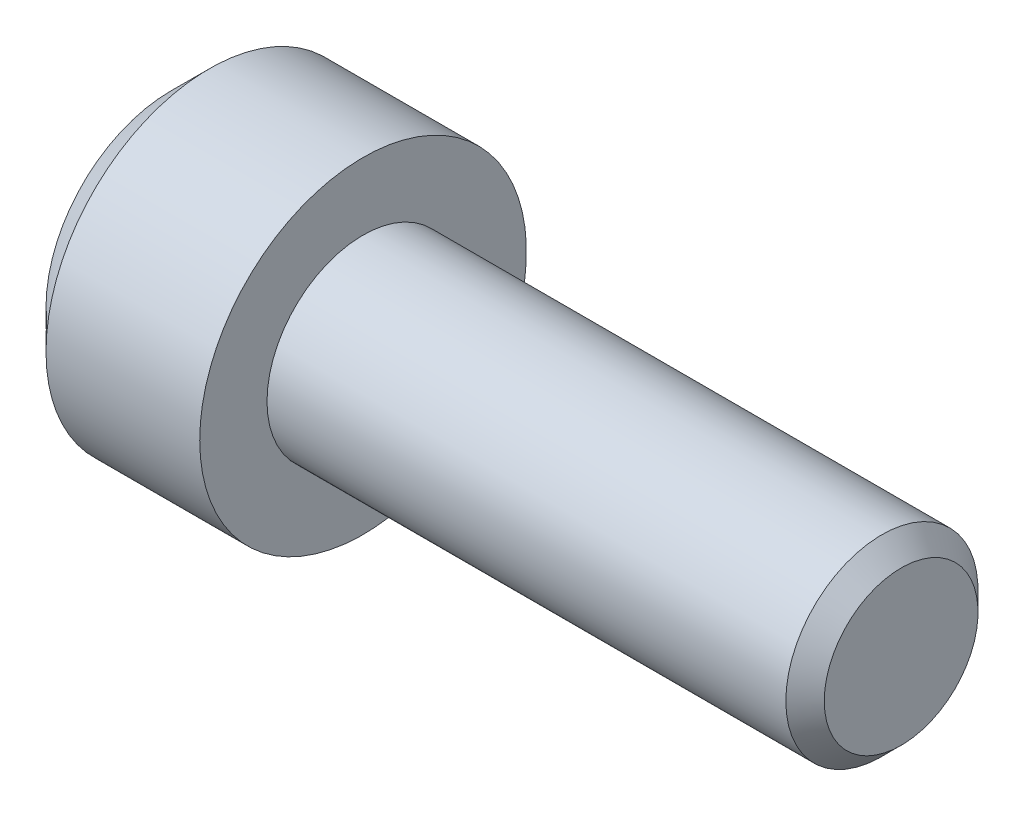
ISO-10303-21;
HEADER;
FILE_DESCRIPTION(('STEP AP214'),'2;1');
FILE_NAME('part.step','',(''),(''),'','','');
FILE_SCHEMA(('AUTOMOTIVE_DESIGN { 1 0 10303 214 1 1 1 1 }'));
ENDSEC;
DATA;
#1=APPLICATION_CONTEXT('core data for automotive mechanical design processes');
#2=APPLICATION_PROTOCOL_DEFINITION('international standard','automotive_design',2000,#1);
#3=PRODUCT_CONTEXT('',#1,'mechanical');
#4=PRODUCT('Part','Part','',(#3));
#5=PRODUCT_RELATED_PRODUCT_CATEGORY('part','',(#4));
#6=PRODUCT_DEFINITION_FORMATION('','',#4);
#7=PRODUCT_DEFINITION_CONTEXT('part definition',#1,'design');
#8=PRODUCT_DEFINITION('design','',#6,#7);
#9=PRODUCT_DEFINITION_SHAPE('','',#8);
#10=(LENGTH_UNIT() NAMED_UNIT(*) SI_UNIT(.MILLI.,.METRE.));
#11=(NAMED_UNIT(*) PLANE_ANGLE_UNIT() SI_UNIT($,.RADIAN.));
#12=(NAMED_UNIT(*) SI_UNIT($,.STERADIAN.) SOLID_ANGLE_UNIT());
#13=UNCERTAINTY_MEASURE_WITH_UNIT(LENGTH_MEASURE(1.E-05),#10,'distance_accuracy_value','');
#14=(GEOMETRIC_REPRESENTATION_CONTEXT(3) GLOBAL_UNCERTAINTY_ASSIGNED_CONTEXT((#13)) GLOBAL_UNIT_ASSIGNED_CONTEXT((#10,
#11,#12)) REPRESENTATION_CONTEXT('',''));
#15=CARTESIAN_POINT('',(0.,0.,0.));
#16=DIRECTION('',(0.,0.,1.));
#17=DIRECTION('',(1.,0.,0.));
#18=AXIS2_PLACEMENT_3D('',#15,#16,#17);
#19=CARTESIAN_POINT('',(0.,0.,0.));
#20=DIRECTION('',(-1.,0.,0.));
#21=DIRECTION('',(0.,0.,1.));
#22=AXIS2_PLACEMENT_3D('',#19,#20,#21);
#23=PLANE('',#22);
#24=CARTESIAN_POINT('',(0.,0.,0.));
#25=DIRECTION('',(-1.,0.,0.));
#26=DIRECTION('',(0.,0.,1.));
#27=AXIS2_PLACEMENT_3D('',#24,#25,#26);
#28=CIRCLE('',#27,2.);
#29=CARTESIAN_POINT('',(0.,0.,2.));
#30=VERTEX_POINT('',#29);
#31=EDGE_CURVE('E151',#30,#30,#28,.F.);
#32=ORIENTED_EDGE('',*,*,#31,.T.);
#33=EDGE_LOOP('',(#32));
#34=FACE_BOUND('',#33,.T.);
#35=ADVANCED_FACE('F45',(#34),#23,.F.);
#36=CARTESIAN_POINT('',(0.,0.,0.));
#37=DIRECTION('',(-1.,0.,0.));
#38=DIRECTION('',(0.,0.,1.));
#39=AXIS2_PLACEMENT_3D('',#36,#37,#38);
#40=CYLINDRICAL_SURFACE('',#39,2.5);
#41=CARTESIAN_POINT('',(-0.499999999999997,0.,0.));
#42=DIRECTION('',(-1.,0.,0.));
#43=DIRECTION('',(0.,0.,1.));
#44=AXIS2_PLACEMENT_3D('',#41,#42,#43);
#45=CIRCLE('',#44,2.5);
#46=CARTESIAN_POINT('',(-0.499999999999997,0.,2.5));
#47=VERTEX_POINT('',#46);
#48=EDGE_CURVE('E147',#47,#47,#45,.T.);
#49=ORIENTED_EDGE('',*,*,#48,.T.);
#50=EDGE_LOOP('',(#49));
#51=FACE_BOUND('',#50,.T.);
#52=CARTESIAN_POINT('',(-14.,0.,0.));
#53=DIRECTION('',(-1.,0.,0.));
#54=DIRECTION('',(0.,0.,1.));
#55=AXIS2_PLACEMENT_3D('',#52,#53,#54);
#56=CIRCLE('',#55,2.5);
#57=CARTESIAN_POINT('',(-14.,0.,2.5));
#58=VERTEX_POINT('',#57);
#59=EDGE_CURVE('E144',#58,#58,#56,.T.);
#60=ORIENTED_EDGE('',*,*,#59,.F.);
#61=EDGE_LOOP('',(#60));
#62=FACE_BOUND('',#61,.T.);
#63=ADVANCED_FACE('F175',(#51,#62),#40,.T.);
#64=CARTESIAN_POINT('',(-14.,2.5,0.));
#65=DIRECTION('',(-1.,0.,0.));
#66=DIRECTION('',(0.,0.,1.));
#67=AXIS2_PLACEMENT_3D('',#64,#65,#66);
#68=PLANE('',#67);
#69=CARTESIAN_POINT('',(-14.,0.,0.));
#70=DIRECTION('',(-1.,0.,0.));
#71=DIRECTION('',(0.,0.,1.));
#72=AXIS2_PLACEMENT_3D('',#69,#70,#71);
#73=CIRCLE('',#72,4.25);
#74=CARTESIAN_POINT('',(-14.,0.,4.25));
#75=VERTEX_POINT('',#74);
#76=EDGE_CURVE('E128',#75,#75,#73,.T.);
#77=ORIENTED_EDGE('',*,*,#76,.F.);
#78=EDGE_LOOP('',(#77));
#79=FACE_BOUND('',#78,.T.);
#80=ORIENTED_EDGE('',*,*,#59,.T.);
#81=EDGE_LOOP('',(#80));
#82=FACE_BOUND('',#81,.T.);
#83=ADVANCED_FACE('F180',(#79,#82),#68,.F.);
#84=CARTESIAN_POINT('',(0.,0.,0.));
#85=DIRECTION('',(-1.,0.,0.));
#86=DIRECTION('',(0.,0.,1.));
#87=AXIS2_PLACEMENT_3D('',#84,#85,#86);
#88=CYLINDRICAL_SURFACE('',#87,4.25);
#89=CARTESIAN_POINT('',(-18.,0.,0.));
#90=DIRECTION('',(1.,0.,0.));
#91=DIRECTION('',(0.,0.,-1.));
#92=AXIS2_PLACEMENT_3D('',#89,#90,#91);
#93=CIRCLE('',#92,4.25);
#94=CARTESIAN_POINT('',(-18.,0.,-4.25));
#95=VERTEX_POINT('',#94);
#96=EDGE_CURVE('E11',#95,#95,#93,.T.);
#97=ORIENTED_EDGE('',*,*,#96,.T.);
#98=EDGE_LOOP('',(#97));
#99=FACE_BOUND('',#98,.T.);
#100=ORIENTED_EDGE('',*,*,#76,.T.);
#101=EDGE_LOOP('',(#100));
#102=FACE_BOUND('',#101,.T.);
#103=ADVANCED_FACE('F192',(#99,#102),#88,.T.);
#104=CARTESIAN_POINT('',(-19.,4.25,0.));
#105=DIRECTION('',(1.,0.,0.));
#106=DIRECTION('',(0.,0.,-1.));
#107=AXIS2_PLACEMENT_3D('',#104,#105,#106);
#108=PLANE('',#107);
#109=CARTESIAN_POINT('',(-19.,0.,0.));
#110=DIRECTION('',(1.,0.,0.));
#111=DIRECTION('',(0.,0.,-1.));
#112=AXIS2_PLACEMENT_3D('',#109,#110,#111);
#113=CIRCLE('',#112,3.25);
#114=CARTESIAN_POINT('',(-19.,0.,-3.25));
#115=VERTEX_POINT('',#114);
#116=EDGE_CURVE('E54',#115,#115,#113,.F.);
#117=ORIENTED_EDGE('',*,*,#116,.T.);
#118=EDGE_LOOP('',(#117));
#119=FACE_BOUND('',#118,.T.);
#120=DIRECTION('',(0.,-0.5,-0.866025403784439));
#121=VECTOR('',#120,1.);
#122=CARTESIAN_POINT('',(-19.,2.3094010767585,0.));
#123=LINE('',#122,#121);
#124=CARTESIAN_POINT('',(-19.,2.3094010767585,0.));
#125=VERTEX_POINT('',#124);
#126=CARTESIAN_POINT('',(-19.,1.15470053837925,-2.));
#127=VERTEX_POINT('',#126);
#128=EDGE_CURVE('E378',#125,#127,#123,.T.);
#129=ORIENTED_EDGE('',*,*,#128,.F.);
#130=DIRECTION('',(0.,0.5,-0.866025403784439));
#131=VECTOR('',#130,1.);
#132=CARTESIAN_POINT('',(-19.,1.15470053837925,2.));
#133=LINE('',#132,#131);
#134=CARTESIAN_POINT('',(-19.,1.15470053837925,2.));
#135=VERTEX_POINT('',#134);
#136=EDGE_CURVE('E61',#135,#125,#133,.T.);
#137=ORIENTED_EDGE('',*,*,#136,.F.);
#138=DIRECTION('',(0.,1.,0.));
#139=VECTOR('',#138,1.);
#140=CARTESIAN_POINT('',(-19.,-1.15470053837925,2.));
#141=LINE('',#140,#139);
#142=CARTESIAN_POINT('',(-19.,-1.15470053837925,2.));
#143=VERTEX_POINT('',#142);
#144=EDGE_CURVE('E96',#143,#135,#141,.T.);
#145=ORIENTED_EDGE('',*,*,#144,.F.);
#146=DIRECTION('',(0.,0.5,0.866025403784439));
#147=VECTOR('',#146,1.);
#148=CARTESIAN_POINT('',(-19.,-2.3094010767585,0.));
#149=LINE('',#148,#147);
#150=CARTESIAN_POINT('',(-19.,-2.3094010767585,0.));
#151=VERTEX_POINT('',#150);
#152=EDGE_CURVE('E105',#151,#143,#149,.T.);
#153=ORIENTED_EDGE('',*,*,#152,.F.);
#154=DIRECTION('',(0.,-0.5,0.866025403784439));
#155=VECTOR('',#154,1.);
#156=CARTESIAN_POINT('',(-19.,-1.15470053837925,-2.));
#157=LINE('',#156,#155);
#158=CARTESIAN_POINT('',(-19.,-1.15470053837925,-2.));
#159=VERTEX_POINT('',#158);
#160=EDGE_CURVE('E112',#159,#151,#157,.T.);
#161=ORIENTED_EDGE('',*,*,#160,.F.);
#162=DIRECTION('',(0.,-1.,0.));
#163=VECTOR('',#162,1.);
#164=CARTESIAN_POINT('',(-19.,1.15470053837925,-2.));
#165=LINE('',#164,#163);
#166=EDGE_CURVE('E382',#127,#159,#165,.T.);
#167=ORIENTED_EDGE('',*,*,#166,.F.);
#168=EDGE_LOOP('',(#129,#137,#145,#153,#161,#167));
#169=FACE_BOUND('',#168,.T.);
#170=ADVANCED_FACE('F115',(#119,#169),#108,.F.);
#171=CARTESIAN_POINT('',(-0.499999999999997,0.,0.));
#172=DIRECTION('',(-1.,0.,0.));
#173=DIRECTION('',(0.,0.,1.));
#174=AXIS2_PLACEMENT_3D('',#171,#172,#173);
#175=CONICAL_SURFACE('',#174,2.5,0.78539816339745);
#176=ORIENTED_EDGE('',*,*,#31,.F.);
#177=EDGE_LOOP('',(#176));
#178=FACE_BOUND('',#177,.T.);
#179=ORIENTED_EDGE('',*,*,#48,.F.);
#180=EDGE_LOOP('',(#179));
#181=FACE_BOUND('',#180,.T.);
#182=ADVANCED_FACE('F184',(#178,#181),#175,.T.);
#183=CARTESIAN_POINT('',(-16.5,1.15470053837925,2.));
#184=DIRECTION('',(0.,0.866025403784439,0.5));
#185=DIRECTION('',(0.,-0.5,0.866025403784439));
#186=AXIS2_PLACEMENT_3D('',#183,#184,#185);
#187=PLANE('',#186);
#188=ORIENTED_EDGE('',*,*,#136,.T.);
#189=DIRECTION('',(-1.,0.,0.));
#190=VECTOR('',#189,1.);
#191=CARTESIAN_POINT('',(-16.5,2.3094010767585,0.));
#192=LINE('',#191,#190);
#193=CARTESIAN_POINT('',(-16.5,2.3094010767585,0.));
#194=VERTEX_POINT('',#193);
#195=EDGE_CURVE('E138',#194,#125,#192,.T.);
#196=ORIENTED_EDGE('',*,*,#195,.F.);
#197=DIRECTION('',(0.,0.5,-0.866025403784439));
#198=VECTOR('',#197,1.);
#199=CARTESIAN_POINT('',(-16.5,1.15470053837925,2.));
#200=LINE('',#199,#198);
#201=CARTESIAN_POINT('',(-16.5,1.15470053837925,2.));
#202=VERTEX_POINT('',#201);
#203=EDGE_CURVE('E117',#202,#194,#200,.T.);
#204=ORIENTED_EDGE('',*,*,#203,.F.);
#205=DIRECTION('',(-1.,0.,0.));
#206=VECTOR('',#205,1.);
#207=CARTESIAN_POINT('',(-16.5,1.15470053837925,2.));
#208=LINE('',#207,#206);
#209=EDGE_CURVE('E101',#202,#135,#208,.T.);
#210=ORIENTED_EDGE('',*,*,#209,.T.);
#211=EDGE_LOOP('',(#188,#196,#204,#210));
#212=FACE_BOUND('',#211,.T.);
#213=ADVANCED_FACE('F186',(#212),#187,.F.);
#214=CARTESIAN_POINT('',(-16.5,-1.15470053837925,2.));
#215=DIRECTION('',(0.,0.,1.));
#216=DIRECTION('',(0.,-1.,0.));
#217=AXIS2_PLACEMENT_3D('',#214,#215,#216);
#218=PLANE('',#217);
#219=ORIENTED_EDGE('',*,*,#144,.T.);
#220=ORIENTED_EDGE('',*,*,#209,.F.);
#221=DIRECTION('',(0.,1.,0.));
#222=VECTOR('',#221,1.);
#223=CARTESIAN_POINT('',(-16.5,-1.15470053837925,2.));
#224=LINE('',#223,#222);
#225=CARTESIAN_POINT('',(-16.5,-1.15470053837925,2.));
#226=VERTEX_POINT('',#225);
#227=EDGE_CURVE('E98',#226,#202,#224,.T.);
#228=ORIENTED_EDGE('',*,*,#227,.F.);
#229=DIRECTION('',(-1.,0.,0.));
#230=VECTOR('',#229,1.);
#231=CARTESIAN_POINT('',(-16.5,-1.15470053837925,2.));
#232=LINE('',#231,#230);
#233=EDGE_CURVE('E91',#226,#143,#232,.T.);
#234=ORIENTED_EDGE('',*,*,#233,.T.);
#235=EDGE_LOOP('',(#219,#220,#228,#234));
#236=FACE_BOUND('',#235,.T.);
#237=ADVANCED_FACE('F93',(#236),#218,.F.);
#238=CARTESIAN_POINT('',(-16.5,-2.3094010767585,0.));
#239=DIRECTION('',(0.,-0.866025403784439,0.5));
#240=DIRECTION('',(0.,-0.5,-0.866025403784439));
#241=AXIS2_PLACEMENT_3D('',#238,#239,#240);
#242=PLANE('',#241);
#243=ORIENTED_EDGE('',*,*,#152,.T.);
#244=ORIENTED_EDGE('',*,*,#233,.F.);
#245=DIRECTION('',(0.,0.5,0.866025403784439));
#246=VECTOR('',#245,1.);
#247=CARTESIAN_POINT('',(-16.5,-2.3094010767585,0.));
#248=LINE('',#247,#246);
#249=CARTESIAN_POINT('',(-16.5,-2.3094010767585,0.));
#250=VERTEX_POINT('',#249);
#251=EDGE_CURVE('E70',#250,#226,#248,.T.);
#252=ORIENTED_EDGE('',*,*,#251,.F.);
#253=DIRECTION('',(-1.,0.,0.));
#254=VECTOR('',#253,1.);
#255=CARTESIAN_POINT('',(-16.5,-2.3094010767585,0.));
#256=LINE('',#255,#254);
#257=EDGE_CURVE('E102',#250,#151,#256,.T.);
#258=ORIENTED_EDGE('',*,*,#257,.T.);
#259=EDGE_LOOP('',(#243,#244,#252,#258));
#260=FACE_BOUND('',#259,.T.);
#261=ADVANCED_FACE('F106',(#260),#242,.F.);
#262=CARTESIAN_POINT('',(-16.5,-1.15470053837925,-2.));
#263=DIRECTION('',(0.,-0.866025403784439,-0.5));
#264=DIRECTION('',(0.,0.5,-0.866025403784439));
#265=AXIS2_PLACEMENT_3D('',#262,#263,#264);
#266=PLANE('',#265);
#267=ORIENTED_EDGE('',*,*,#160,.T.);
#268=ORIENTED_EDGE('',*,*,#257,.F.);
#269=DIRECTION('',(0.,-0.5,0.866025403784439));
#270=VECTOR('',#269,1.);
#271=CARTESIAN_POINT('',(-16.5,-1.15470053837925,-2.));
#272=LINE('',#271,#270);
#273=CARTESIAN_POINT('',(-16.5,-1.15470053837925,-2.));
#274=VERTEX_POINT('',#273);
#275=EDGE_CURVE('E371',#274,#250,#272,.T.);
#276=ORIENTED_EDGE('',*,*,#275,.F.);
#277=DIRECTION('',(-1.,0.,0.));
#278=VECTOR('',#277,1.);
#279=CARTESIAN_POINT('',(-16.5,-1.15470053837925,-2.));
#280=LINE('',#279,#278);
#281=EDGE_CURVE('E132',#274,#159,#280,.T.);
#282=ORIENTED_EDGE('',*,*,#281,.T.);
#283=EDGE_LOOP('',(#267,#268,#276,#282));
#284=FACE_BOUND('',#283,.T.);
#285=ADVANCED_FACE('F210',(#284),#266,.F.);
#286=CARTESIAN_POINT('',(-16.5,1.15470053837925,-2.));
#287=DIRECTION('',(0.,0.,-1.));
#288=DIRECTION('',(-1.,0.,0.));
#289=AXIS2_PLACEMENT_3D('',#286,#287,#288);
#290=PLANE('',#289);
#291=ORIENTED_EDGE('',*,*,#166,.T.);
#292=ORIENTED_EDGE('',*,*,#281,.F.);
#293=DIRECTION('',(0.,-1.,0.));
#294=VECTOR('',#293,1.);
#295=CARTESIAN_POINT('',(-16.5,1.15470053837925,-2.));
#296=LINE('',#295,#294);
#297=CARTESIAN_POINT('',(-16.5,1.15470053837925,-2.));
#298=VERTEX_POINT('',#297);
#299=EDGE_CURVE('E369',#298,#274,#296,.T.);
#300=ORIENTED_EDGE('',*,*,#299,.F.);
#301=DIRECTION('',(-1.,0.,0.));
#302=VECTOR('',#301,1.);
#303=CARTESIAN_POINT('',(-16.5,1.15470053837925,-2.));
#304=LINE('',#303,#302);
#305=EDGE_CURVE('E135',#298,#127,#304,.T.);
#306=ORIENTED_EDGE('',*,*,#305,.T.);
#307=EDGE_LOOP('',(#291,#292,#300,#306));
#308=FACE_BOUND('',#307,.T.);
#309=ADVANCED_FACE('F170',(#308),#290,.F.);
#310=CARTESIAN_POINT('',(-16.5,2.3094010767585,0.));
#311=DIRECTION('',(0.,0.866025403784439,-0.5));
#312=DIRECTION('',(0.,0.5,0.866025403784439));
#313=AXIS2_PLACEMENT_3D('',#310,#311,#312);
#314=PLANE('',#313);
#315=ORIENTED_EDGE('',*,*,#128,.T.);
#316=ORIENTED_EDGE('',*,*,#305,.F.);
#317=DIRECTION('',(0.,-0.5,-0.866025403784439));
#318=VECTOR('',#317,1.);
#319=CARTESIAN_POINT('',(-16.5,2.3094010767585,0.));
#320=LINE('',#319,#318);
#321=EDGE_CURVE('E123',#194,#298,#320,.T.);
#322=ORIENTED_EDGE('',*,*,#321,.F.);
#323=ORIENTED_EDGE('',*,*,#195,.T.);
#324=EDGE_LOOP('',(#315,#316,#322,#323));
#325=FACE_BOUND('',#324,.T.);
#326=ADVANCED_FACE('F162',(#325),#314,.F.);
#327=CARTESIAN_POINT('',(-19.,0.,0.));
#328=DIRECTION('',(1.,0.,0.));
#329=DIRECTION('',(0.,0.,-1.));
#330=AXIS2_PLACEMENT_3D('',#327,#328,#329);
#331=CONICAL_SURFACE('',#330,3.25,0.785398163397447);
#332=ORIENTED_EDGE('',*,*,#96,.F.);
#333=EDGE_LOOP('',(#332));
#334=FACE_BOUND('',#333,.T.);
#335=ORIENTED_EDGE('',*,*,#116,.F.);
#336=EDGE_LOOP('',(#335));
#337=FACE_BOUND('',#336,.T.);
#338=ADVANCED_FACE('F47',(#334,#337),#331,.T.);
#339=CARTESIAN_POINT('',(-16.5,-1.15470053837925,-2.));
#340=DIRECTION('',(0.857167300702113,-0.446036056788338,-0.257519037455026));
#341=DIRECTION('',(0.461604487477352,0.887085845417889,0.));
#342=AXIS2_PLACEMENT_3D('',#339,#340,#341);
#343=PLANE('',#342);
#344=ORIENTED_EDGE('',*,*,#275,.T.);
#345=DIRECTION('',(-0.461604487477352,-0.887085845417889,0.));
#346=VECTOR('',#345,1.);
#347=CARTESIAN_POINT('',(-16.027169982274,-1.40074263128796,0.));
#348=LINE('',#347,#346);
#349=CARTESIAN_POINT('',(-15.2982787619449,0.,0.));
#350=VERTEX_POINT('',#349);
#351=EDGE_CURVE('E390',#350,#250,#348,.T.);
#352=ORIENTED_EDGE('',*,*,#351,.F.);
#353=DIRECTION('',(-0.461604487477352,-0.443542922708944,-0.768238877469488));
#354=VECTOR('',#353,1.);
#355=CARTESIAN_POINT('',(-16.027169982274,-0.700371315643979,-1.21307870285923));
#356=LINE('',#355,#354);
#357=EDGE_CURVE('E355',#350,#274,#356,.T.);
#358=ORIENTED_EDGE('',*,*,#357,.T.);
#359=EDGE_LOOP('',(#344,#352,#358));
#360=FACE_BOUND('',#359,.T.);
#361=ADVANCED_FACE('F161',(#360),#343,.F.);
#362=CARTESIAN_POINT('',(-16.5,1.15470053837925,-2.));
#363=DIRECTION('',(0.857167300702113,0.,-0.515038074910052));
#364=DIRECTION('',(-0.515038074910052,0.,-0.857167300702113));
#365=AXIS2_PLACEMENT_3D('',#362,#363,#364);
#366=PLANE('',#365);
#367=ORIENTED_EDGE('',*,*,#299,.T.);
#368=ORIENTED_EDGE('',*,*,#357,.F.);
#369=DIRECTION('',(-0.461604487477352,0.443542922708945,-0.768238877469487));
#370=VECTOR('',#369,1.);
#371=CARTESIAN_POINT('',(-16.027169982274,0.700371315643978,-1.21307870285923));
#372=LINE('',#371,#370);
#373=EDGE_CURVE('E357',#350,#298,#372,.T.);
#374=ORIENTED_EDGE('',*,*,#373,.T.);
#375=EDGE_LOOP('',(#367,#368,#374));
#376=FACE_BOUND('',#375,.T.);
#377=ADVANCED_FACE('F167',(#376),#366,.F.);
#378=CARTESIAN_POINT('',(-16.5,2.3094010767585,0.));
#379=DIRECTION('',(0.857167300702113,0.446036056788338,-0.257519037455026));
#380=DIRECTION('',(-0.461604487477352,0.887085845417889,0.));
#381=AXIS2_PLACEMENT_3D('',#378,#379,#380);
#382=PLANE('',#381);
#383=ORIENTED_EDGE('',*,*,#321,.T.);
#384=ORIENTED_EDGE('',*,*,#373,.F.);
#385=DIRECTION('',(-0.461604487477352,0.887085845417889,0.));
#386=VECTOR('',#385,1.);
#387=CARTESIAN_POINT('',(-16.027169982274,1.40074263128796,0.));
#388=LINE('',#387,#386);
#389=EDGE_CURVE('E342',#350,#194,#388,.T.);
#390=ORIENTED_EDGE('',*,*,#389,.T.);
#391=EDGE_LOOP('',(#383,#384,#390));
#392=FACE_BOUND('',#391,.T.);
#393=ADVANCED_FACE('F221',(#392),#382,.F.);
#394=CARTESIAN_POINT('',(-16.5,1.15470053837925,2.));
#395=DIRECTION('',(0.857167300702113,0.446036056788338,0.257519037455026));
#396=DIRECTION('',(-0.461604487477352,0.887085845417889,0.));
#397=AXIS2_PLACEMENT_3D('',#394,#395,#396);
#398=PLANE('',#397);
#399=ORIENTED_EDGE('',*,*,#203,.T.);
#400=ORIENTED_EDGE('',*,*,#389,.F.);
#401=DIRECTION('',(-0.461604487477352,0.443542922708944,0.768238877469488));
#402=VECTOR('',#401,1.);
#403=CARTESIAN_POINT('',(-16.027169982274,0.700371315643978,1.21307870285923));
#404=LINE('',#403,#402);
#405=EDGE_CURVE('E332',#350,#202,#404,.T.);
#406=ORIENTED_EDGE('',*,*,#405,.T.);
#407=EDGE_LOOP('',(#399,#400,#406));
#408=FACE_BOUND('',#407,.T.);
#409=ADVANCED_FACE('F225',(#408),#398,.F.);
#410=CARTESIAN_POINT('',(-16.5,-1.15470053837925,2.));
#411=DIRECTION('',(0.857167300702113,0.,0.515038074910052));
#412=DIRECTION('',(0.515038074910052,0.,-0.857167300702114));
#413=AXIS2_PLACEMENT_3D('',#410,#411,#412);
#414=PLANE('',#413);
#415=ORIENTED_EDGE('',*,*,#227,.T.);
#416=ORIENTED_EDGE('',*,*,#405,.F.);
#417=DIRECTION('',(-0.461604487477352,-0.443542922708945,0.768238877469488));
#418=VECTOR('',#417,1.);
#419=CARTESIAN_POINT('',(-16.027169982274,-0.700371315643978,1.21307870285923));
#420=LINE('',#419,#418);
#421=EDGE_CURVE('E333',#350,#226,#420,.T.);
#422=ORIENTED_EDGE('',*,*,#421,.T.);
#423=EDGE_LOOP('',(#415,#416,#422));
#424=FACE_BOUND('',#423,.T.);
#425=ADVANCED_FACE('F229',(#424),#414,.F.);
#426=CARTESIAN_POINT('',(-16.5,-2.3094010767585,0.));
#427=DIRECTION('',(0.857167300702113,-0.446036056788338,0.257519037455026));
#428=DIRECTION('',(0.461604487477352,0.887085845417889,0.));
#429=AXIS2_PLACEMENT_3D('',#426,#427,#428);
#430=PLANE('',#429);
#431=ORIENTED_EDGE('',*,*,#251,.T.);
#432=ORIENTED_EDGE('',*,*,#421,.F.);
#433=ORIENTED_EDGE('',*,*,#351,.T.);
#434=EDGE_LOOP('',(#431,#432,#433));
#435=FACE_BOUND('',#434,.T.);
#436=ADVANCED_FACE('F233',(#435),#430,.F.);
#437=CLOSED_SHELL('',(#35,#63,#83,#103,#170,#182,#213,#237,#261,#285,#309,#326,#338,#361,#377,
#393,#409,#425,#436));
#438=MANIFOLD_SOLID_BREP('B2',#437);
#439=ADVANCED_BREP_SHAPE_REPRESENTATION('',(#18,#438),#14);
#440=SHAPE_DEFINITION_REPRESENTATION(#9,#439);
ENDSEC;
END-ISO-10303-21;
